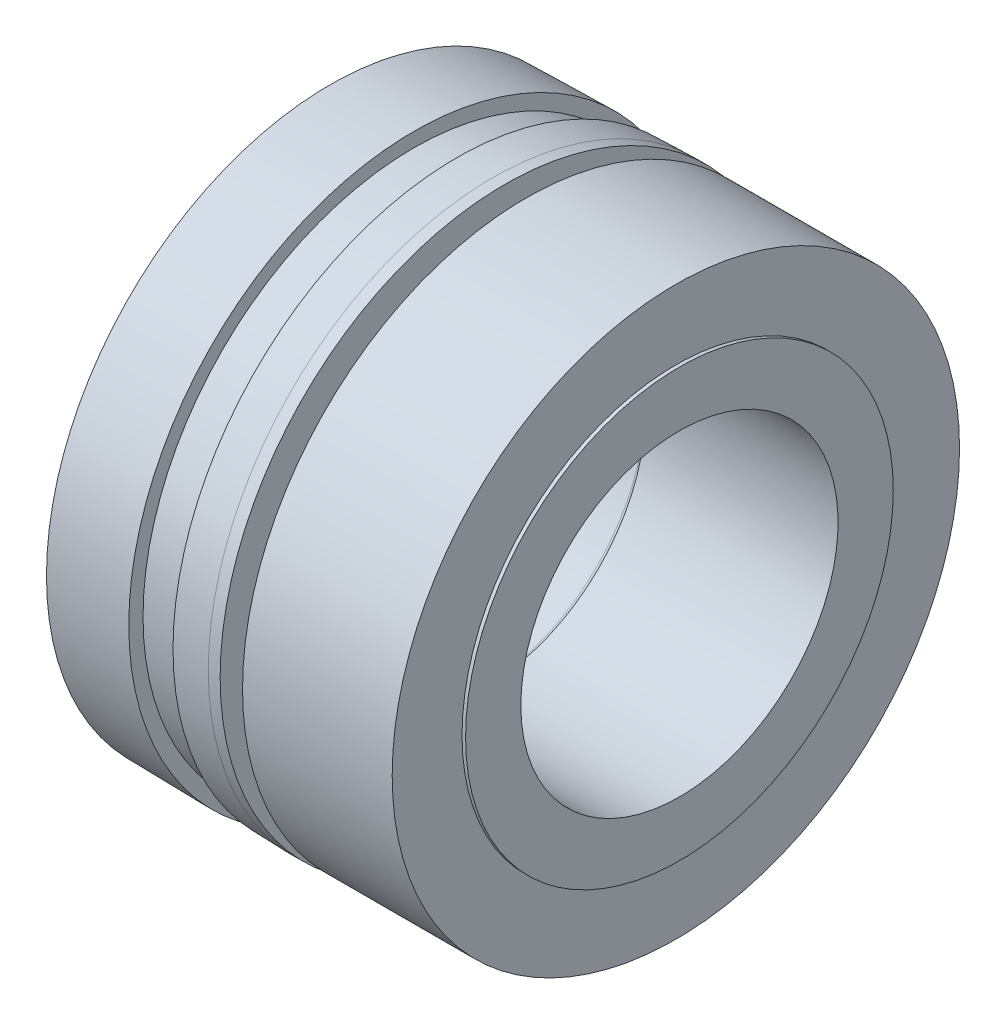
ISO-10303-21;
HEADER;
FILE_DESCRIPTION(('STEP AP214'),'2;1');
FILE_NAME('part.step','',(''),(''),'','','');
FILE_SCHEMA(('AUTOMOTIVE_DESIGN { 1 0 10303 214 1 1 1 1 }'));
ENDSEC;
DATA;
#1=APPLICATION_CONTEXT('core data for automotive mechanical design processes');
#2=APPLICATION_PROTOCOL_DEFINITION('international standard','automotive_design',2000,#1);
#3=PRODUCT_CONTEXT('',#1,'mechanical');
#4=PRODUCT('Part','Part','',(#3));
#5=PRODUCT_RELATED_PRODUCT_CATEGORY('part','',(#4));
#6=PRODUCT_DEFINITION_FORMATION('','',#4);
#7=PRODUCT_DEFINITION_CONTEXT('part definition',#1,'design');
#8=PRODUCT_DEFINITION('design','',#6,#7);
#9=PRODUCT_DEFINITION_SHAPE('','',#8);
#10=(LENGTH_UNIT() NAMED_UNIT(*) SI_UNIT(.MILLI.,.METRE.));
#11=(NAMED_UNIT(*) PLANE_ANGLE_UNIT() SI_UNIT($,.RADIAN.));
#12=(NAMED_UNIT(*) SI_UNIT($,.STERADIAN.) SOLID_ANGLE_UNIT());
#13=UNCERTAINTY_MEASURE_WITH_UNIT(LENGTH_MEASURE(1.E-05),#10,'distance_accuracy_value','');
#14=(GEOMETRIC_REPRESENTATION_CONTEXT(3) GLOBAL_UNCERTAINTY_ASSIGNED_CONTEXT((#13)) GLOBAL_UNIT_ASSIGNED_CONTEXT((#10,
#11,#12)) REPRESENTATION_CONTEXT('',''));
#15=CARTESIAN_POINT('',(0.,0.,0.));
#16=DIRECTION('',(0.,0.,1.));
#17=DIRECTION('',(1.,0.,0.));
#18=AXIS2_PLACEMENT_3D('',#15,#16,#17);
#19=CARTESIAN_POINT('',(-16.3632955758615,0.,0.));
#20=DIRECTION('',(-1.,0.,0.));
#21=DIRECTION('',(0.,0.,1.));
#22=AXIS2_PLACEMENT_3D('',#19,#20,#21);
#23=TOROIDAL_SURFACE('',#22,22.25,0.995362620095558);
#24=CARTESIAN_POINT('',(-16.3632955758615,0.,0.));
#25=DIRECTION('',(-1.,0.,0.));
#26=DIRECTION('',(0.,0.,1.));
#27=AXIS2_PLACEMENT_3D('',#24,#25,#26);
#28=CIRCLE('',#27,23.2453626200956);
#29=CARTESIAN_POINT('',(-16.3632955758615,0.,23.2453626200956));
#30=VERTEX_POINT('',#29);
#31=EDGE_CURVE('E106',#30,#30,#28,.T.);
#32=ORIENTED_EDGE('',*,*,#31,.T.);
#33=EDGE_LOOP('',(#32));
#34=FACE_BOUND('',#33,.T.);
#35=CARTESIAN_POINT('',(-15.367932955766,0.,0.));
#36=DIRECTION('',(-1.,0.,0.));
#37=DIRECTION('',(0.,0.,1.));
#38=AXIS2_PLACEMENT_3D('',#35,#36,#37);
#39=CIRCLE('',#38,22.25);
#40=CARTESIAN_POINT('',(-15.367932955766,0.,22.25));
#41=VERTEX_POINT('',#40);
#42=EDGE_CURVE('E10',#41,#41,#39,.T.);
#43=ORIENTED_EDGE('',*,*,#42,.F.);
#44=EDGE_LOOP('',(#43));
#45=FACE_BOUND('',#44,.T.);
#46=ADVANCED_FACE('F30',(#34,#45),#23,.F.);
#47=CARTESIAN_POINT('',(-66.0264767181984,0.,0.));
#48=DIRECTION('',(-1.,0.,0.));
#49=DIRECTION('',(0.,0.,1.));
#50=AXIS2_PLACEMENT_3D('',#47,#48,#49);
#51=CYLINDRICAL_SURFACE('',#50,22.25);
#52=ORIENTED_EDGE('',*,*,#42,.T.);
#53=EDGE_LOOP('',(#52));
#54=FACE_BOUND('',#53,.T.);
#55=CARTESIAN_POINT('',(11.632067044234,0.,0.));
#56=DIRECTION('',(-1.,0.,0.));
#57=DIRECTION('',(0.,0.,1.));
#58=AXIS2_PLACEMENT_3D('',#55,#56,#57);
#59=CIRCLE('',#58,22.25);
#60=CARTESIAN_POINT('',(11.632067044234,0.,22.25));
#61=VERTEX_POINT('',#60);
#62=EDGE_CURVE('E36',#61,#61,#59,.T.);
#63=ORIENTED_EDGE('',*,*,#62,.F.);
#64=EDGE_LOOP('',(#63));
#65=FACE_BOUND('',#64,.T.);
#66=ADVANCED_FACE('F124',(#54,#65),#51,.F.);
#67=CARTESIAN_POINT('',(11.632067044234,-30.,0.));
#68=DIRECTION('',(1.,0.,0.));
#69=DIRECTION('',(0.,0.,-1.));
#70=AXIS2_PLACEMENT_3D('',#67,#68,#69);
#71=PLANE('',#70);
#72=ORIENTED_EDGE('',*,*,#62,.T.);
#73=EDGE_LOOP('',(#72));
#74=FACE_BOUND('',#73,.T.);
#75=CARTESIAN_POINT('',(11.632067044234,0.,0.));
#76=DIRECTION('',(-1.,0.,0.));
#77=DIRECTION('',(0.,0.,1.));
#78=AXIS2_PLACEMENT_3D('',#75,#76,#77);
#79=CIRCLE('',#78,30.);
#80=CARTESIAN_POINT('',(11.632067044234,0.,30.));
#81=VERTEX_POINT('',#80);
#82=EDGE_CURVE('E40',#81,#81,#79,.T.);
#83=ORIENTED_EDGE('',*,*,#82,.F.);
#84=EDGE_LOOP('',(#83));
#85=FACE_BOUND('',#84,.T.);
#86=ADVANCED_FACE('F128',(#74,#85),#71,.T.);
#87=CARTESIAN_POINT('',(-66.0264767181984,0.,0.));
#88=DIRECTION('',(-1.,0.,0.));
#89=DIRECTION('',(0.,0.,1.));
#90=AXIS2_PLACEMENT_3D('',#87,#88,#89);
#91=CYLINDRICAL_SURFACE('',#90,30.);
#92=ORIENTED_EDGE('',*,*,#82,.T.);
#93=EDGE_LOOP('',(#92));
#94=FACE_BOUND('',#93,.T.);
#95=CARTESIAN_POINT('',(11.132067044234,0.,0.));
#96=DIRECTION('',(-1.,0.,0.));
#97=DIRECTION('',(0.,0.,1.));
#98=AXIS2_PLACEMENT_3D('',#95,#96,#97);
#99=CIRCLE('',#98,30.);
#100=CARTESIAN_POINT('',(11.132067044234,0.,30.));
#101=VERTEX_POINT('',#100);
#102=EDGE_CURVE('E44',#101,#101,#99,.T.);
#103=ORIENTED_EDGE('',*,*,#102,.F.);
#104=EDGE_LOOP('',(#103));
#105=FACE_BOUND('',#104,.T.);
#106=ADVANCED_FACE('F132',(#94,#105),#91,.T.);
#107=CARTESIAN_POINT('',(11.132067044234,-39.7948837619112,0.));
#108=DIRECTION('',(1.,0.,0.));
#109=DIRECTION('',(0.,0.,-1.));
#110=AXIS2_PLACEMENT_3D('',#107,#108,#109);
#111=PLANE('',#110);
#112=ORIENTED_EDGE('',*,*,#102,.T.);
#113=EDGE_LOOP('',(#112));
#114=FACE_BOUND('',#113,.T.);
#115=CARTESIAN_POINT('',(11.132067044234,0.,0.));
#116=DIRECTION('',(-1.,0.,0.));
#117=DIRECTION('',(0.,0.,1.));
#118=AXIS2_PLACEMENT_3D('',#115,#116,#117);
#119=CIRCLE('',#118,39.7948837619112);
#120=CARTESIAN_POINT('',(11.132067044234,0.,39.7948837619112));
#121=VERTEX_POINT('',#120);
#122=EDGE_CURVE('E49',#121,#121,#119,.T.);
#123=ORIENTED_EDGE('',*,*,#122,.F.);
#124=EDGE_LOOP('',(#123));
#125=FACE_BOUND('',#124,.T.);
#126=ADVANCED_FACE('F138',(#114,#125),#111,.T.);
#127=CARTESIAN_POINT('',(-66.0264767181984,0.,0.));
#128=DIRECTION('',(-1.,0.,0.));
#129=DIRECTION('',(0.,0.,1.));
#130=AXIS2_PLACEMENT_3D('',#127,#128,#129);
#131=CYLINDRICAL_SURFACE('',#130,39.7948837619112);
#132=ORIENTED_EDGE('',*,*,#122,.T.);
#133=EDGE_LOOP('',(#132));
#134=FACE_BOUND('',#133,.T.);
#135=CARTESIAN_POINT('',(-9.86329557586155,0.,0.));
#136=DIRECTION('',(-1.,0.,0.));
#137=DIRECTION('',(0.,0.,1.));
#138=AXIS2_PLACEMENT_3D('',#135,#136,#137);
#139=CIRCLE('',#138,39.7948837619112);
#140=CARTESIAN_POINT('',(-9.86329557586155,0.,39.7948837619112));
#141=VERTEX_POINT('',#140);
#142=EDGE_CURVE('E52',#141,#141,#139,.T.);
#143=ORIENTED_EDGE('',*,*,#142,.F.);
#144=EDGE_LOOP('',(#143));
#145=FACE_BOUND('',#144,.T.);
#146=ADVANCED_FACE('F142',(#134,#145),#131,.T.);
#147=CARTESIAN_POINT('',(-9.86329557586154,-35.,0.));
#148=DIRECTION('',(-1.,0.,0.));
#149=DIRECTION('',(0.,0.,1.));
#150=AXIS2_PLACEMENT_3D('',#147,#148,#149);
#151=PLANE('',#150);
#152=ORIENTED_EDGE('',*,*,#142,.T.);
#153=EDGE_LOOP('',(#152));
#154=FACE_BOUND('',#153,.T.);
#155=CARTESIAN_POINT('',(-9.86329557586155,0.,0.));
#156=DIRECTION('',(-1.,0.,0.));
#157=DIRECTION('',(0.,0.,1.));
#158=AXIS2_PLACEMENT_3D('',#155,#156,#157);
#159=CIRCLE('',#158,35.);
#160=CARTESIAN_POINT('',(-9.86329557586155,0.,35.));
#161=VERTEX_POINT('',#160);
#162=EDGE_CURVE('E55',#161,#161,#159,.T.);
#163=ORIENTED_EDGE('',*,*,#162,.F.);
#164=EDGE_LOOP('',(#163));
#165=FACE_BOUND('',#164,.T.);
#166=ADVANCED_FACE('F146',(#154,#165),#151,.T.);
#167=CARTESIAN_POINT('',(-66.0264767181984,0.,0.));
#168=DIRECTION('',(-1.,0.,0.));
#169=DIRECTION('',(0.,0.,1.));
#170=AXIS2_PLACEMENT_3D('',#167,#168,#169);
#171=CYLINDRICAL_SURFACE('',#170,35.);
#172=ORIENTED_EDGE('',*,*,#162,.T.);
#173=EDGE_LOOP('',(#172));
#174=FACE_BOUND('',#173,.T.);
#175=CARTESIAN_POINT('',(-12.8632955758615,0.,0.));
#176=DIRECTION('',(-1.,0.,0.));
#177=DIRECTION('',(0.,0.,1.));
#178=AXIS2_PLACEMENT_3D('',#175,#176,#177);
#179=CIRCLE('',#178,35.);
#180=CARTESIAN_POINT('',(-12.8632955758615,0.,35.));
#181=VERTEX_POINT('',#180);
#182=EDGE_CURVE('E58',#181,#181,#179,.T.);
#183=ORIENTED_EDGE('',*,*,#182,.F.);
#184=EDGE_LOOP('',(#183));
#185=FACE_BOUND('',#184,.T.);
#186=ADVANCED_FACE('F150',(#174,#185),#171,.T.);
#187=CARTESIAN_POINT('',(-12.8632955758615,-39.9365025050572,0.));
#188=DIRECTION('',(1.,0.,0.));
#189=DIRECTION('',(0.,0.,-1.));
#190=AXIS2_PLACEMENT_3D('',#187,#188,#189);
#191=PLANE('',#190);
#192=ORIENTED_EDGE('',*,*,#182,.T.);
#193=EDGE_LOOP('',(#192));
#194=FACE_BOUND('',#193,.T.);
#195=CARTESIAN_POINT('',(-12.8632955758615,0.,0.));
#196=DIRECTION('',(-1.,0.,0.));
#197=DIRECTION('',(0.,0.,1.));
#198=AXIS2_PLACEMENT_3D('',#195,#196,#197);
#199=CIRCLE('',#198,39.9365025050572);
#200=CARTESIAN_POINT('',(-12.8632955758615,0.,39.9365025050572));
#201=VERTEX_POINT('',#200);
#202=EDGE_CURVE('E61',#201,#201,#199,.T.);
#203=ORIENTED_EDGE('',*,*,#202,.F.);
#204=EDGE_LOOP('',(#203));
#205=FACE_BOUND('',#204,.T.);
#206=ADVANCED_FACE('F154',(#194,#205),#191,.T.);
#207=CARTESIAN_POINT('',(-66.0264767181984,0.,0.));
#208=DIRECTION('',(-1.,0.,0.));
#209=DIRECTION('',(0.,0.,1.));
#210=AXIS2_PLACEMENT_3D('',#207,#208,#209);
#211=CYLINDRICAL_SURFACE('',#210,39.9365025050572);
#212=ORIENTED_EDGE('',*,*,#202,.T.);
#213=EDGE_LOOP('',(#212));
#214=FACE_BOUND('',#213,.T.);
#215=CARTESIAN_POINT('',(-14.5313340366775,0.,0.));
#216=DIRECTION('',(-1.,0.,0.));
#217=DIRECTION('',(0.,0.,1.));
#218=AXIS2_PLACEMENT_3D('',#215,#216,#217);
#219=CIRCLE('',#218,39.9365025050572);
#220=CARTESIAN_POINT('',(-14.5313340366775,0.,39.9365025050572));
#221=VERTEX_POINT('',#220);
#222=EDGE_CURVE('E64',#221,#221,#219,.T.);
#223=ORIENTED_EDGE('',*,*,#222,.F.);
#224=EDGE_LOOP('',(#223));
#225=FACE_BOUND('',#224,.T.);
#226=ADVANCED_FACE('F158',(#214,#225),#211,.T.);
#227=CARTESIAN_POINT('',(-19.6168315458067,0.,0.));
#228=DIRECTION('',(1.,0.,0.));
#229=DIRECTION('',(0.,0.,-1.));
#230=AXIS2_PLACEMENT_3D('',#227,#228,#229);
#231=CONICAL_SURFACE('',#230,39.7948837619112,0.0278403739416791);
#232=ORIENTED_EDGE('',*,*,#222,.T.);
#233=EDGE_LOOP('',(#232));
#234=FACE_BOUND('',#233,.T.);
#235=CARTESIAN_POINT('',(-19.6168315458067,0.,0.));
#236=DIRECTION('',(-1.,0.,0.));
#237=DIRECTION('',(0.,0.,1.));
#238=AXIS2_PLACEMENT_3D('',#235,#236,#237);
#239=CIRCLE('',#238,39.7948837619112);
#240=CARTESIAN_POINT('',(-19.6168315458067,0.,39.7948837619112));
#241=VERTEX_POINT('',#240);
#242=EDGE_CURVE('E67',#241,#241,#239,.T.);
#243=ORIENTED_EDGE('',*,*,#242,.F.);
#244=EDGE_LOOP('',(#243));
#245=FACE_BOUND('',#244,.T.);
#246=ADVANCED_FACE('F162',(#234,#245),#231,.T.);
#247=CARTESIAN_POINT('',(-19.6168315458067,-38.,0.));
#248=DIRECTION('',(-1.,0.,0.));
#249=DIRECTION('',(0.,0.,1.));
#250=AXIS2_PLACEMENT_3D('',#247,#248,#249);
#251=PLANE('',#250);
#252=ORIENTED_EDGE('',*,*,#242,.T.);
#253=EDGE_LOOP('',(#252));
#254=FACE_BOUND('',#253,.T.);
#255=CARTESIAN_POINT('',(-19.6168315458067,0.,0.));
#256=DIRECTION('',(-1.,0.,0.));
#257=DIRECTION('',(0.,0.,1.));
#258=AXIS2_PLACEMENT_3D('',#255,#256,#257);
#259=CIRCLE('',#258,38.);
#260=CARTESIAN_POINT('',(-19.6168315458067,0.,38.));
#261=VERTEX_POINT('',#260);
#262=EDGE_CURVE('E70',#261,#261,#259,.T.);
#263=ORIENTED_EDGE('',*,*,#262,.F.);
#264=EDGE_LOOP('',(#263));
#265=FACE_BOUND('',#264,.T.);
#266=ADVANCED_FACE('F166',(#254,#265),#251,.T.);
#267=CARTESIAN_POINT('',(-66.0264767181984,0.,0.));
#268=DIRECTION('',(-1.,0.,0.));
#269=DIRECTION('',(0.,0.,1.));
#270=AXIS2_PLACEMENT_3D('',#267,#268,#269);
#271=CYLINDRICAL_SURFACE('',#270,38.);
#272=ORIENTED_EDGE('',*,*,#262,.T.);
#273=EDGE_LOOP('',(#272));
#274=FACE_BOUND('',#273,.T.);
#275=CARTESIAN_POINT('',(-25.6168315458067,0.,0.));
#276=DIRECTION('',(-1.,0.,0.));
#277=DIRECTION('',(0.,0.,1.));
#278=AXIS2_PLACEMENT_3D('',#275,#276,#277);
#279=CIRCLE('',#278,38.);
#280=CARTESIAN_POINT('',(-25.6168315458067,0.,38.));
#281=VERTEX_POINT('',#280);
#282=EDGE_CURVE('E73',#281,#281,#279,.T.);
#283=ORIENTED_EDGE('',*,*,#282,.F.);
#284=EDGE_LOOP('',(#283));
#285=FACE_BOUND('',#284,.T.);
#286=ADVANCED_FACE('F170',(#274,#285),#271,.T.);
#287=CARTESIAN_POINT('',(-25.6168315458067,-40.,0.));
#288=DIRECTION('',(1.,0.,0.));
#289=DIRECTION('',(0.,0.,-1.));
#290=AXIS2_PLACEMENT_3D('',#287,#288,#289);
#291=PLANE('',#290);
#292=ORIENTED_EDGE('',*,*,#282,.T.);
#293=EDGE_LOOP('',(#292));
#294=FACE_BOUND('',#293,.T.);
#295=CARTESIAN_POINT('',(-25.6168315458067,0.,0.));
#296=DIRECTION('',(-1.,0.,0.));
#297=DIRECTION('',(0.,0.,1.));
#298=AXIS2_PLACEMENT_3D('',#295,#296,#297);
#299=CIRCLE('',#298,40.);
#300=CARTESIAN_POINT('',(-25.6168315458067,0.,40.));
#301=VERTEX_POINT('',#300);
#302=EDGE_CURVE('E76',#301,#301,#299,.T.);
#303=ORIENTED_EDGE('',*,*,#302,.F.);
#304=EDGE_LOOP('',(#303));
#305=FACE_BOUND('',#304,.T.);
#306=ADVANCED_FACE('F174',(#294,#305),#291,.T.);
#307=CARTESIAN_POINT('',(-37.367932955766,0.,0.));
#308=DIRECTION('',(1.,0.,0.));
#309=DIRECTION('',(0.,0.,-1.));
#310=AXIS2_PLACEMENT_3D('',#307,#308,#309);
#311=CONICAL_SURFACE('',#310,39.7948837619112,0.0174532925199362);
#312=ORIENTED_EDGE('',*,*,#302,.T.);
#313=EDGE_LOOP('',(#312));
#314=FACE_BOUND('',#313,.T.);
#315=CARTESIAN_POINT('',(-37.367932955766,0.,0.));
#316=DIRECTION('',(-1.,0.,0.));
#317=DIRECTION('',(0.,0.,1.));
#318=AXIS2_PLACEMENT_3D('',#315,#316,#317);
#319=CIRCLE('',#318,39.7948837619112);
#320=CARTESIAN_POINT('',(-37.367932955766,0.,39.7948837619112));
#321=VERTEX_POINT('',#320);
#322=EDGE_CURVE('E79',#321,#321,#319,.T.);
#323=ORIENTED_EDGE('',*,*,#322,.F.);
#324=EDGE_LOOP('',(#323));
#325=FACE_BOUND('',#324,.T.);
#326=ADVANCED_FACE('F178',(#314,#325),#311,.T.);
#327=CARTESIAN_POINT('',(-37.367932955766,-33.3320323883918,0.));
#328=DIRECTION('',(-1.,0.,0.));
#329=DIRECTION('',(0.,0.,1.));
#330=AXIS2_PLACEMENT_3D('',#327,#328,#329);
#331=PLANE('',#330);
#332=ORIENTED_EDGE('',*,*,#322,.T.);
#333=EDGE_LOOP('',(#332));
#334=FACE_BOUND('',#333,.T.);
#335=CARTESIAN_POINT('',(-37.367932955766,0.,0.));
#336=DIRECTION('',(-1.,0.,0.));
#337=DIRECTION('',(0.,0.,1.));
#338=AXIS2_PLACEMENT_3D('',#335,#336,#337);
#339=CIRCLE('',#338,33.3320323883918);
#340=CARTESIAN_POINT('',(-37.367932955766,0.,33.3320323883918));
#341=VERTEX_POINT('',#340);
#342=EDGE_CURVE('E82',#341,#341,#339,.T.);
#343=ORIENTED_EDGE('',*,*,#342,.F.);
#344=EDGE_LOOP('',(#343));
#345=FACE_BOUND('',#344,.T.);
#346=ADVANCED_FACE('F182',(#334,#345),#331,.T.);
#347=CARTESIAN_POINT('',(-66.0264767181984,0.,0.));
#348=DIRECTION('',(-1.,0.,0.));
#349=DIRECTION('',(0.,0.,1.));
#350=AXIS2_PLACEMENT_3D('',#347,#348,#349);
#351=CYLINDRICAL_SURFACE('',#350,33.3320323883918);
#352=ORIENTED_EDGE('',*,*,#342,.T.);
#353=EDGE_LOOP('',(#352));
#354=FACE_BOUND('',#353,.T.);
#355=CARTESIAN_POINT('',(-34.4679154663879,0.,0.));
#356=DIRECTION('',(-1.,0.,0.));
#357=DIRECTION('',(0.,0.,1.));
#358=AXIS2_PLACEMENT_3D('',#355,#356,#357);
#359=CIRCLE('',#358,33.3320323883918);
#360=CARTESIAN_POINT('',(-34.4679154663879,0.,33.3320323883918));
#361=VERTEX_POINT('',#360);
#362=EDGE_CURVE('E85',#361,#361,#359,.T.);
#363=ORIENTED_EDGE('',*,*,#362,.F.);
#364=EDGE_LOOP('',(#363));
#365=FACE_BOUND('',#364,.T.);
#366=ADVANCED_FACE('F186',(#354,#365),#351,.F.);
#367=CARTESIAN_POINT('',(-34.4679154663879,-33.3320323883918,0.));
#368=DIRECTION('',(1.,0.,0.));
#369=DIRECTION('',(0.,0.,-1.));
#370=AXIS2_PLACEMENT_3D('',#367,#368,#369);
#371=PLANE('',#370);
#372=ORIENTED_EDGE('',*,*,#362,.T.);
#373=EDGE_LOOP('',(#372));
#374=FACE_BOUND('',#373,.T.);
#375=CARTESIAN_POINT('',(-34.4679154663879,0.,0.));
#376=DIRECTION('',(-1.,0.,0.));
#377=DIRECTION('',(0.,0.,1.));
#378=AXIS2_PLACEMENT_3D('',#375,#376,#377);
#379=CIRCLE('',#378,34.8320323883918);
#380=CARTESIAN_POINT('',(-34.4679154663879,0.,34.8320323883918));
#381=VERTEX_POINT('',#380);
#382=EDGE_CURVE('E88',#381,#381,#379,.T.);
#383=ORIENTED_EDGE('',*,*,#382,.F.);
#384=EDGE_LOOP('',(#383));
#385=FACE_BOUND('',#384,.T.);
#386=ADVANCED_FACE('F190',(#374,#385),#371,.T.);
#387=CARTESIAN_POINT('',(-66.0264767181984,0.,0.));
#388=DIRECTION('',(-1.,0.,0.));
#389=DIRECTION('',(0.,0.,1.));
#390=AXIS2_PLACEMENT_3D('',#387,#388,#389);
#391=CYLINDRICAL_SURFACE('',#390,34.8320323883918);
#392=ORIENTED_EDGE('',*,*,#382,.T.);
#393=EDGE_LOOP('',(#392));
#394=FACE_BOUND('',#393,.T.);
#395=CARTESIAN_POINT('',(-32.9679154663879,0.,0.));
#396=DIRECTION('',(-1.,0.,0.));
#397=DIRECTION('',(0.,0.,1.));
#398=AXIS2_PLACEMENT_3D('',#395,#396,#397);
#399=CIRCLE('',#398,34.8320323883918);
#400=CARTESIAN_POINT('',(-32.9679154663879,0.,34.8320323883918));
#401=VERTEX_POINT('',#400);
#402=EDGE_CURVE('E91',#401,#401,#399,.T.);
#403=ORIENTED_EDGE('',*,*,#402,.F.);
#404=EDGE_LOOP('',(#403));
#405=FACE_BOUND('',#404,.T.);
#406=ADVANCED_FACE('F194',(#394,#405),#391,.F.);
#407=CARTESIAN_POINT('',(-32.9679154663879,-34.8320323883918,0.));
#408=DIRECTION('',(-1.,0.,0.));
#409=DIRECTION('',(0.,0.,1.));
#410=AXIS2_PLACEMENT_3D('',#407,#408,#409);
#411=PLANE('',#410);
#412=ORIENTED_EDGE('',*,*,#402,.T.);
#413=EDGE_LOOP('',(#412));
#414=FACE_BOUND('',#413,.T.);
#415=CARTESIAN_POINT('',(-32.9679154663879,0.,0.));
#416=DIRECTION('',(-1.,0.,0.));
#417=DIRECTION('',(0.,0.,1.));
#418=AXIS2_PLACEMENT_3D('',#415,#416,#417);
#419=CIRCLE('',#418,33.3320323883918);
#420=CARTESIAN_POINT('',(-32.9679154663879,0.,33.3320323883918));
#421=VERTEX_POINT('',#420);
#422=EDGE_CURVE('E94',#421,#421,#419,.T.);
#423=ORIENTED_EDGE('',*,*,#422,.F.);
#424=EDGE_LOOP('',(#423));
#425=FACE_BOUND('',#424,.T.);
#426=ADVANCED_FACE('F198',(#414,#425),#411,.T.);
#427=CARTESIAN_POINT('',(-66.0264767181984,0.,0.));
#428=DIRECTION('',(-1.,0.,0.));
#429=DIRECTION('',(0.,0.,1.));
#430=AXIS2_PLACEMENT_3D('',#427,#428,#429);
#431=CYLINDRICAL_SURFACE('',#430,33.3320323883918);
#432=ORIENTED_EDGE('',*,*,#422,.T.);
#433=EDGE_LOOP('',(#432));
#434=FACE_BOUND('',#433,.T.);
#435=CARTESIAN_POINT('',(-24.3632955758615,0.,0.));
#436=DIRECTION('',(-1.,0.,0.));
#437=DIRECTION('',(0.,0.,1.));
#438=AXIS2_PLACEMENT_3D('',#435,#436,#437);
#439=CIRCLE('',#438,33.3320323883918);
#440=CARTESIAN_POINT('',(-24.3632955758615,0.,33.3320323883918));
#441=VERTEX_POINT('',#440);
#442=EDGE_CURVE('E97',#441,#441,#439,.T.);
#443=ORIENTED_EDGE('',*,*,#442,.F.);
#444=EDGE_LOOP('',(#443));
#445=FACE_BOUND('',#444,.T.);
#446=ADVANCED_FACE('F202',(#434,#445),#431,.F.);
#447=CARTESIAN_POINT('',(-24.3632955758615,0.,0.));
#448=DIRECTION('',(-1.,0.,0.));
#449=DIRECTION('',(0.,0.,1.));
#450=AXIS2_PLACEMENT_3D('',#447,#448,#449);
#451=TOROIDAL_SURFACE('',#450,30.3320323883918,2.99999999999999);
#452=ORIENTED_EDGE('',*,*,#442,.T.);
#453=EDGE_LOOP('',(#452));
#454=FACE_BOUND('',#453,.T.);
#455=CARTESIAN_POINT('',(-21.3632955758615,0.,0.));
#456=DIRECTION('',(-1.,0.,0.));
#457=DIRECTION('',(0.,0.,1.));
#458=AXIS2_PLACEMENT_3D('',#455,#456,#457);
#459=CIRCLE('',#458,30.3320323883918);
#460=CARTESIAN_POINT('',(-21.3632955758615,0.,30.3320323883918));
#461=VERTEX_POINT('',#460);
#462=EDGE_CURVE('E100',#461,#461,#459,.T.);
#463=ORIENTED_EDGE('',*,*,#462,.F.);
#464=EDGE_LOOP('',(#463));
#465=FACE_BOUND('',#464,.T.);
#466=ADVANCED_FACE('F120',(#454,#465),#451,.F.);
#467=CARTESIAN_POINT('',(-21.3632955758615,-23.2453626200956,0.));
#468=DIRECTION('',(-1.,0.,0.));
#469=DIRECTION('',(0.,0.,1.));
#470=AXIS2_PLACEMENT_3D('',#467,#468,#469);
#471=PLANE('',#470);
#472=ORIENTED_EDGE('',*,*,#462,.T.);
#473=EDGE_LOOP('',(#472));
#474=FACE_BOUND('',#473,.T.);
#475=CARTESIAN_POINT('',(-21.3632955758615,0.,0.));
#476=DIRECTION('',(-1.,0.,0.));
#477=DIRECTION('',(0.,0.,1.));
#478=AXIS2_PLACEMENT_3D('',#475,#476,#477);
#479=CIRCLE('',#478,23.2453626200956);
#480=CARTESIAN_POINT('',(-21.3632955758615,0.,23.2453626200956));
#481=VERTEX_POINT('',#480);
#482=EDGE_CURVE('E103',#481,#481,#479,.T.);
#483=ORIENTED_EDGE('',*,*,#482,.F.);
#484=EDGE_LOOP('',(#483));
#485=FACE_BOUND('',#484,.T.);
#486=ADVANCED_FACE('F114',(#474,#485),#471,.T.);
#487=CARTESIAN_POINT('',(-66.0264767181984,0.,0.));
#488=DIRECTION('',(-1.,0.,0.));
#489=DIRECTION('',(0.,0.,1.));
#490=AXIS2_PLACEMENT_3D('',#487,#488,#489);
#491=CYLINDRICAL_SURFACE('',#490,23.2453626200956);
#492=ORIENTED_EDGE('',*,*,#482,.T.);
#493=EDGE_LOOP('',(#492));
#494=FACE_BOUND('',#493,.T.);
#495=ORIENTED_EDGE('',*,*,#31,.F.);
#496=EDGE_LOOP('',(#495));
#497=FACE_BOUND('',#496,.T.);
#498=ADVANCED_FACE('F112',(#494,#497),#491,.F.);
#499=CLOSED_SHELL('',(#46,#66,#86,#106,#126,#146,#166,#186,#206,#226,#246,#266,#286,#306,#326,
#346,#366,#386,#406,#426,#446,#466,#486,#498));
#500=MANIFOLD_SOLID_BREP('B2',#499);
#501=ADVANCED_BREP_SHAPE_REPRESENTATION('',(#18,#500),#14);
#502=SHAPE_DEFINITION_REPRESENTATION(#9,#501);
ENDSEC;
END-ISO-10303-21;
